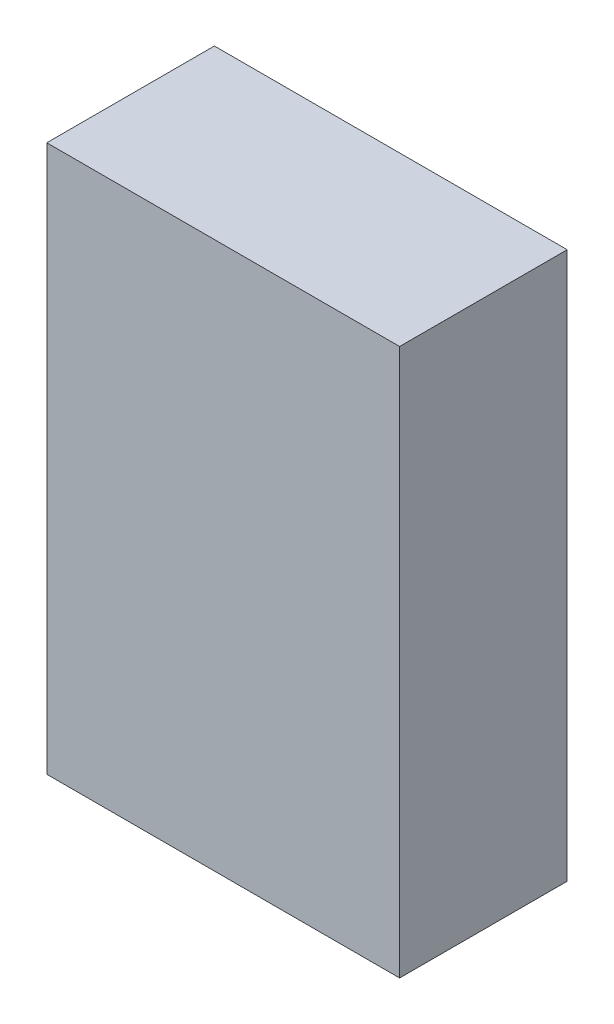
ISO-10303-21;
HEADER;
FILE_DESCRIPTION(('STEP AP214'),'2;1');
FILE_NAME('part.step','',(''),(''),'','','');
FILE_SCHEMA(('AUTOMOTIVE_DESIGN { 1 0 10303 214 1 1 1 1 }'));
ENDSEC;
DATA;
#1=APPLICATION_CONTEXT('core data for automotive mechanical design processes');
#2=APPLICATION_PROTOCOL_DEFINITION('international standard','automotive_design',2000,#1);
#3=PRODUCT_CONTEXT('',#1,'mechanical');
#4=PRODUCT('Part','Part','',(#3));
#5=PRODUCT_RELATED_PRODUCT_CATEGORY('part','',(#4));
#6=PRODUCT_DEFINITION_FORMATION('','',#4);
#7=PRODUCT_DEFINITION_CONTEXT('part definition',#1,'design');
#8=PRODUCT_DEFINITION('design','',#6,#7);
#9=PRODUCT_DEFINITION_SHAPE('','',#8);
#10=(LENGTH_UNIT() NAMED_UNIT(*) SI_UNIT(.MILLI.,.METRE.));
#11=(NAMED_UNIT(*) PLANE_ANGLE_UNIT() SI_UNIT($,.RADIAN.));
#12=(NAMED_UNIT(*) SI_UNIT($,.STERADIAN.) SOLID_ANGLE_UNIT());
#13=UNCERTAINTY_MEASURE_WITH_UNIT(LENGTH_MEASURE(1.E-05),#10,'distance_accuracy_value','');
#14=(GEOMETRIC_REPRESENTATION_CONTEXT(3) GLOBAL_UNCERTAINTY_ASSIGNED_CONTEXT((#13)) GLOBAL_UNIT_ASSIGNED_CONTEXT((#10,
#11,#12)) REPRESENTATION_CONTEXT('',''));
#15=CARTESIAN_POINT('',(0.,0.,0.));
#16=DIRECTION('',(0.,0.,1.));
#17=DIRECTION('',(1.,0.,0.));
#18=AXIS2_PLACEMENT_3D('',#15,#16,#17);
#19=CARTESIAN_POINT('',(10.,-15.5,9.5));
#20=DIRECTION('',(-1.,0.,0.));
#21=DIRECTION('',(0.,0.,1.));
#22=AXIS2_PLACEMENT_3D('',#19,#20,#21);
#23=PLANE('',#22);
#24=DIRECTION('',(0.,1.,0.));
#25=VECTOR('',#24,1.);
#26=CARTESIAN_POINT('',(10.,-15.5,0.));
#27=LINE('',#26,#25);
#28=CARTESIAN_POINT('',(10.,-15.5,0.));
#29=VERTEX_POINT('',#28);
#30=CARTESIAN_POINT('',(10.,15.5,0.));
#31=VERTEX_POINT('',#30);
#32=EDGE_CURVE('E113',#29,#31,#27,.T.);
#33=ORIENTED_EDGE('',*,*,#32,.T.);
#34=DIRECTION('',(0.,0.,-1.));
#35=VECTOR('',#34,1.);
#36=CARTESIAN_POINT('',(10.,15.5,9.5));
#37=LINE('',#36,#35);
#38=CARTESIAN_POINT('',(10.,15.5,9.5));
#39=VERTEX_POINT('',#38);
#40=EDGE_CURVE('E11',#39,#31,#37,.T.);
#41=ORIENTED_EDGE('',*,*,#40,.F.);
#42=DIRECTION('',(0.,1.,0.));
#43=VECTOR('',#42,1.);
#44=CARTESIAN_POINT('',(10.,-15.5,9.5));
#45=LINE('',#44,#43);
#46=CARTESIAN_POINT('',(10.,-15.5,9.5));
#47=VERTEX_POINT('',#46);
#48=EDGE_CURVE('E97',#47,#39,#45,.T.);
#49=ORIENTED_EDGE('',*,*,#48,.F.);
#50=DIRECTION('',(0.,0.,-1.));
#51=VECTOR('',#50,1.);
#52=CARTESIAN_POINT('',(10.,-15.5,9.5));
#53=LINE('',#52,#51);
#54=EDGE_CURVE('E109',#47,#29,#53,.T.);
#55=ORIENTED_EDGE('',*,*,#54,.T.);
#56=EDGE_LOOP('',(#33,#41,#49,#55));
#57=FACE_BOUND('',#56,.T.);
#58=ADVANCED_FACE('F45',(#57),#23,.F.);
#59=CARTESIAN_POINT('',(-10.,15.5,9.5));
#60=DIRECTION('',(0.,-1.,0.));
#61=DIRECTION('',(0.,0.,-1.));
#62=AXIS2_PLACEMENT_3D('',#59,#60,#61);
#63=PLANE('',#62);
#64=DIRECTION('',(-1.,0.,0.));
#65=VECTOR('',#64,1.);
#66=CARTESIAN_POINT('',(-10.,15.5,0.));
#67=LINE('',#66,#65);
#68=CARTESIAN_POINT('',(-10.,15.5,0.));
#69=VERTEX_POINT('',#68);
#70=EDGE_CURVE('E102',#31,#69,#67,.T.);
#71=ORIENTED_EDGE('',*,*,#70,.T.);
#72=DIRECTION('',(0.,0.,-1.));
#73=VECTOR('',#72,1.);
#74=CARTESIAN_POINT('',(-10.,15.5,9.5));
#75=LINE('',#74,#73);
#76=CARTESIAN_POINT('',(-10.,15.5,9.5));
#77=VERTEX_POINT('',#76);
#78=EDGE_CURVE('E54',#77,#69,#75,.T.);
#79=ORIENTED_EDGE('',*,*,#78,.F.);
#80=DIRECTION('',(-1.,0.,0.));
#81=VECTOR('',#80,1.);
#82=CARTESIAN_POINT('',(-10.,15.5,9.5));
#83=LINE('',#82,#81);
#84=EDGE_CURVE('E92',#39,#77,#83,.T.);
#85=ORIENTED_EDGE('',*,*,#84,.F.);
#86=ORIENTED_EDGE('',*,*,#40,.T.);
#87=EDGE_LOOP('',(#71,#79,#85,#86));
#88=FACE_BOUND('',#87,.T.);
#89=ADVANCED_FACE('F101',(#88),#63,.F.);
#90=CARTESIAN_POINT('',(-10.,-15.5,9.5));
#91=DIRECTION('',(1.,0.,0.));
#92=DIRECTION('',(0.,0.,-1.));
#93=AXIS2_PLACEMENT_3D('',#90,#91,#92);
#94=PLANE('',#93);
#95=DIRECTION('',(0.,-1.,0.));
#96=VECTOR('',#95,1.);
#97=CARTESIAN_POINT('',(-10.,-15.5,0.));
#98=LINE('',#97,#96);
#99=CARTESIAN_POINT('',(-10.,-15.5,0.));
#100=VERTEX_POINT('',#99);
#101=EDGE_CURVE('E79',#69,#100,#98,.T.);
#102=ORIENTED_EDGE('',*,*,#101,.T.);
#103=DIRECTION('',(0.,0.,-1.));
#104=VECTOR('',#103,1.);
#105=CARTESIAN_POINT('',(-10.,-15.5,9.5));
#106=LINE('',#105,#104);
#107=CARTESIAN_POINT('',(-10.,-15.5,9.5));
#108=VERTEX_POINT('',#107);
#109=EDGE_CURVE('E104',#108,#100,#106,.T.);
#110=ORIENTED_EDGE('',*,*,#109,.F.);
#111=DIRECTION('',(0.,-1.,0.));
#112=VECTOR('',#111,1.);
#113=CARTESIAN_POINT('',(-10.,-15.5,9.5));
#114=LINE('',#113,#112);
#115=EDGE_CURVE('E95',#77,#108,#114,.T.);
#116=ORIENTED_EDGE('',*,*,#115,.F.);
#117=ORIENTED_EDGE('',*,*,#78,.T.);
#118=EDGE_LOOP('',(#102,#110,#116,#117));
#119=FACE_BOUND('',#118,.T.);
#120=ADVANCED_FACE('F105',(#119),#94,.F.);
#121=CARTESIAN_POINT('',(-10.,-15.5,9.5));
#122=DIRECTION('',(0.,1.,0.));
#123=DIRECTION('',(0.,0.,1.));
#124=AXIS2_PLACEMENT_3D('',#121,#122,#123);
#125=PLANE('',#124);
#126=DIRECTION('',(1.,0.,0.));
#127=VECTOR('',#126,1.);
#128=CARTESIAN_POINT('',(-10.,-15.5,0.));
#129=LINE('',#128,#127);
#130=EDGE_CURVE('E85',#100,#29,#129,.T.);
#131=ORIENTED_EDGE('',*,*,#130,.T.);
#132=ORIENTED_EDGE('',*,*,#54,.F.);
#133=DIRECTION('',(1.,0.,0.));
#134=VECTOR('',#133,1.);
#135=CARTESIAN_POINT('',(-10.,-15.5,9.5));
#136=LINE('',#135,#134);
#137=EDGE_CURVE('E62',#108,#47,#136,.T.);
#138=ORIENTED_EDGE('',*,*,#137,.F.);
#139=ORIENTED_EDGE('',*,*,#109,.T.);
#140=EDGE_LOOP('',(#131,#132,#138,#139));
#141=FACE_BOUND('',#140,.T.);
#142=ADVANCED_FACE('F126',(#141),#125,.F.);
#143=CARTESIAN_POINT('',(0.,0.,9.5));
#144=DIRECTION('',(0.,0.,-1.));
#145=DIRECTION('',(-1.,0.,0.));
#146=AXIS2_PLACEMENT_3D('',#143,#144,#145);
#147=PLANE('',#146);
#148=ORIENTED_EDGE('',*,*,#48,.T.);
#149=ORIENTED_EDGE('',*,*,#84,.T.);
#150=ORIENTED_EDGE('',*,*,#115,.T.);
#151=ORIENTED_EDGE('',*,*,#137,.T.);
#152=EDGE_LOOP('',(#148,#149,#150,#151));
#153=FACE_BOUND('',#152,.T.);
#154=ADVANCED_FACE('F93',(#153),#147,.F.);
#155=CARTESIAN_POINT('',(0.,0.,0.));
#156=DIRECTION('',(0.,0.,-1.));
#157=DIRECTION('',(-1.,0.,0.));
#158=AXIS2_PLACEMENT_3D('',#155,#156,#157);
#159=PLANE('',#158);
#160=ORIENTED_EDGE('',*,*,#32,.F.);
#161=ORIENTED_EDGE('',*,*,#130,.F.);
#162=ORIENTED_EDGE('',*,*,#101,.F.);
#163=ORIENTED_EDGE('',*,*,#70,.F.);
#164=EDGE_LOOP('',(#160,#161,#162,#163));
#165=FACE_BOUND('',#164,.T.);
#166=ADVANCED_FACE('F129',(#165),#159,.T.);
#167=CLOSED_SHELL('',(#58,#89,#120,#142,#154,#166));
#168=MANIFOLD_SOLID_BREP('B2',#167);
#169=ADVANCED_BREP_SHAPE_REPRESENTATION('',(#18,#168),#14);
#170=SHAPE_DEFINITION_REPRESENTATION(#9,#169);
ENDSEC;
END-ISO-10303-21;
